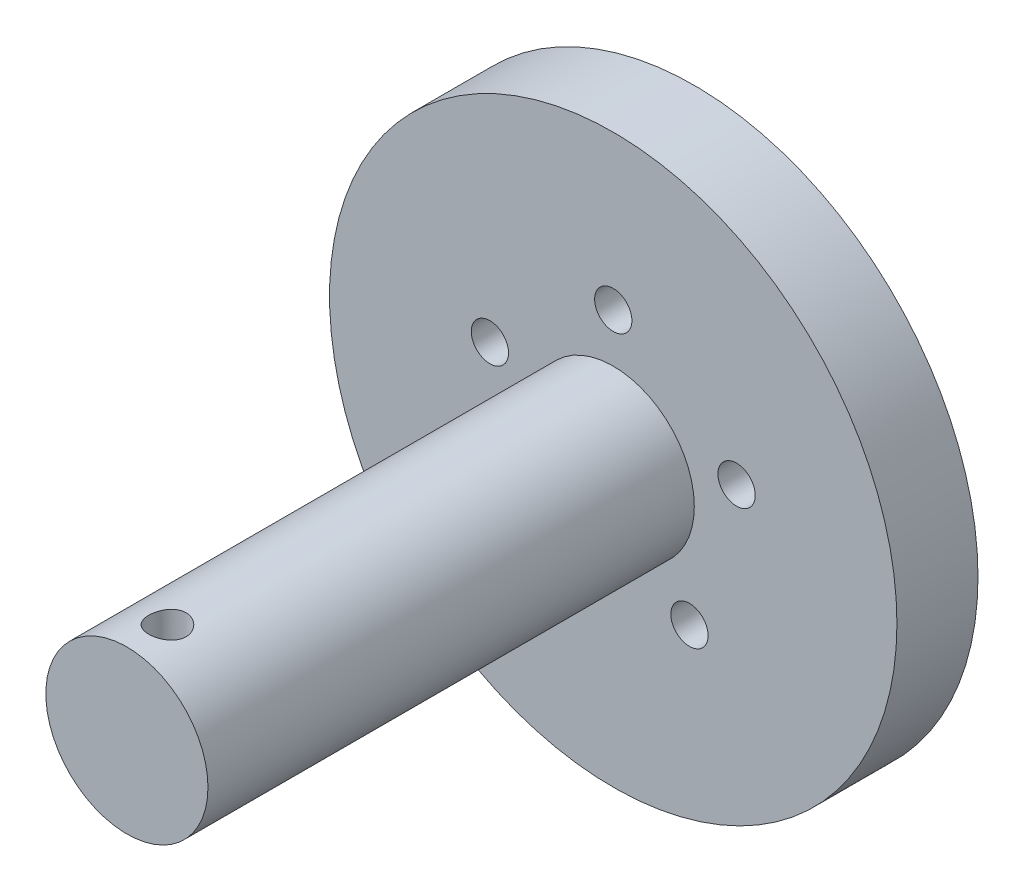
ISO-10303-21;
HEADER;
FILE_DESCRIPTION(('STEP AP214'),'2;1');
FILE_NAME('part.step','',(''),(''),'','','');
FILE_SCHEMA(('AUTOMOTIVE_DESIGN { 1 0 10303 214 1 1 1 1 }'));
ENDSEC;
DATA;
#1=APPLICATION_CONTEXT('core data for automotive mechanical design processes');
#2=APPLICATION_PROTOCOL_DEFINITION('international standard','automotive_design',2000,#1);
#3=PRODUCT_CONTEXT('',#1,'mechanical');
#4=PRODUCT('Part','Part','',(#3));
#5=PRODUCT_RELATED_PRODUCT_CATEGORY('part','',(#4));
#6=PRODUCT_DEFINITION_FORMATION('','',#4);
#7=PRODUCT_DEFINITION_CONTEXT('part definition',#1,'design');
#8=PRODUCT_DEFINITION('design','',#6,#7);
#9=PRODUCT_DEFINITION_SHAPE('','',#8);
#10=(LENGTH_UNIT() NAMED_UNIT(*) SI_UNIT(.MILLI.,.METRE.));
#11=(NAMED_UNIT(*) PLANE_ANGLE_UNIT() SI_UNIT($,.RADIAN.));
#12=(NAMED_UNIT(*) SI_UNIT($,.STERADIAN.) SOLID_ANGLE_UNIT());
#13=UNCERTAINTY_MEASURE_WITH_UNIT(LENGTH_MEASURE(1.E-05),#10,'distance_accuracy_value','');
#14=(GEOMETRIC_REPRESENTATION_CONTEXT(3) GLOBAL_UNCERTAINTY_ASSIGNED_CONTEXT((#13)) GLOBAL_UNIT_ASSIGNED_CONTEXT((#10,
#11,#12)) REPRESENTATION_CONTEXT('',''));
#15=CARTESIAN_POINT('',(0.,0.,0.));
#16=DIRECTION('',(0.,0.,1.));
#17=DIRECTION('',(1.,0.,0.));
#18=AXIS2_PLACEMENT_3D('',#15,#16,#17);
#19=CARTESIAN_POINT('',(0.,0.,12.7));
#20=DIRECTION('',(0.,0.,1.));
#21=DIRECTION('',(1.,0.,0.));
#22=AXIS2_PLACEMENT_3D('',#19,#20,#21);
#23=PLANE('',#22);
#24=CARTESIAN_POINT('',(0.,0.,12.7));
#25=DIRECTION('',(0.,0.,1.));
#26=DIRECTION('',(1.,0.,0.));
#27=AXIS2_PLACEMENT_3D('',#24,#25,#26);
#28=CIRCLE('',#27,12.7);
#29=CARTESIAN_POINT('',(12.7,0.,12.7));
#30=VERTEX_POINT('',#29);
#31=EDGE_CURVE('E92',#30,#30,#28,.T.);
#32=ORIENTED_EDGE('',*,*,#31,.F.);
#33=EDGE_LOOP('',(#32));
#34=FACE_BOUND('',#33,.T.);
#35=CARTESIAN_POINT('',(-11.9437963265832,-16.4392253256988,12.7));
#36=DIRECTION('',(0.,0.,1.));
#37=DIRECTION('',(1.,0.,0.));
#38=AXIS2_PLACEMENT_3D('',#35,#36,#37);
#39=CIRCLE('',#38,2.921);
#40=CARTESIAN_POINT('',(-9.02279632658319,-16.4392253256988,12.7));
#41=VERTEX_POINT('',#40);
#42=EDGE_CURVE('E72',#41,#41,#39,.T.);
#43=ORIENTED_EDGE('',*,*,#42,.F.);
#44=EDGE_LOOP('',(#43));
#45=FACE_BOUND('',#44,.T.);
#46=CARTESIAN_POINT('',(19.3254684111175,6.27922532569888,12.7));
#47=DIRECTION('',(0.,0.,1.));
#48=DIRECTION('',(1.,0.,0.));
#49=AXIS2_PLACEMENT_3D('',#46,#47,#48);
#50=CIRCLE('',#49,2.921);
#51=CARTESIAN_POINT('',(22.2464684111175,6.27922532569888,12.7));
#52=VERTEX_POINT('',#51);
#53=EDGE_CURVE('E56',#52,#52,#50,.T.);
#54=ORIENTED_EDGE('',*,*,#53,.F.);
#55=EDGE_LOOP('',(#54));
#56=FACE_BOUND('',#55,.T.);
#57=CARTESIAN_POINT('',(0.,0.,12.7));
#58=DIRECTION('',(0.,0.,1.));
#59=DIRECTION('',(1.,0.,0.));
#60=AXIS2_PLACEMENT_3D('',#57,#58,#59);
#61=CIRCLE('',#60,44.45);
#62=CARTESIAN_POINT('',(44.45,0.,12.7));
#63=VERTEX_POINT('',#62);
#64=EDGE_CURVE('E10',#63,#63,#61,.T.);
#65=ORIENTED_EDGE('',*,*,#64,.T.);
#66=EDGE_LOOP('',(#65));
#67=FACE_BOUND('',#66,.T.);
#68=CARTESIAN_POINT('',(0.,20.32,12.7));
#69=DIRECTION('',(0.,0.,1.));
#70=DIRECTION('',(1.,0.,0.));
#71=AXIS2_PLACEMENT_3D('',#68,#69,#70);
#72=CIRCLE('',#71,2.921);
#73=CARTESIAN_POINT('',(2.921,20.32,12.7));
#74=VERTEX_POINT('',#73);
#75=EDGE_CURVE('E50',#74,#74,#72,.T.);
#76=ORIENTED_EDGE('',*,*,#75,.F.);
#77=EDGE_LOOP('',(#76));
#78=FACE_BOUND('',#77,.T.);
#79=CARTESIAN_POINT('',(11.943796326583,-16.439225325699,12.7));
#80=DIRECTION('',(0.,0.,1.));
#81=DIRECTION('',(1.,0.,0.));
#82=AXIS2_PLACEMENT_3D('',#79,#80,#81);
#83=CIRCLE('',#82,2.921);
#84=CARTESIAN_POINT('',(14.864796326583,-16.439225325699,12.7));
#85=VERTEX_POINT('',#84);
#86=EDGE_CURVE('E64',#85,#85,#83,.T.);
#87=ORIENTED_EDGE('',*,*,#86,.F.);
#88=EDGE_LOOP('',(#87));
#89=FACE_BOUND('',#88,.T.);
#90=CARTESIAN_POINT('',(-19.3254684111175,6.27922532569915,12.7));
#91=DIRECTION('',(0.,0.,1.));
#92=DIRECTION('',(1.,0.,0.));
#93=AXIS2_PLACEMENT_3D('',#90,#91,#92);
#94=CIRCLE('',#93,2.921);
#95=CARTESIAN_POINT('',(-16.4044684111175,6.27922532569915,12.7));
#96=VERTEX_POINT('',#95);
#97=EDGE_CURVE('E80',#96,#96,#94,.T.);
#98=ORIENTED_EDGE('',*,*,#97,.F.);
#99=EDGE_LOOP('',(#98));
#100=FACE_BOUND('',#99,.T.);
#101=ADVANCED_FACE('F37',(#34,#45,#56,#67,#78,#89,#100),#23,.T.);
#102=CARTESIAN_POINT('',(0.,0.,0.));
#103=DIRECTION('',(0.,0.,1.));
#104=DIRECTION('',(1.,0.,0.));
#105=AXIS2_PLACEMENT_3D('',#102,#103,#104);
#106=PLANE('',#105);
#107=CARTESIAN_POINT('',(0.,0.,0.));
#108=DIRECTION('',(0.,0.,1.));
#109=DIRECTION('',(1.,0.,0.));
#110=AXIS2_PLACEMENT_3D('',#107,#108,#109);
#111=CIRCLE('',#110,44.45);
#112=CARTESIAN_POINT('',(44.45,0.,0.));
#113=VERTEX_POINT('',#112);
#114=EDGE_CURVE('E41',#113,#113,#111,.T.);
#115=ORIENTED_EDGE('',*,*,#114,.F.);
#116=EDGE_LOOP('',(#115));
#117=FACE_BOUND('',#116,.T.);
#118=CARTESIAN_POINT('',(0.,20.32,0.));
#119=DIRECTION('',(0.,0.,1.));
#120=DIRECTION('',(1.,0.,0.));
#121=AXIS2_PLACEMENT_3D('',#118,#119,#120);
#122=CIRCLE('',#121,2.921);
#123=CARTESIAN_POINT('',(2.921,20.32,0.));
#124=VERTEX_POINT('',#123);
#125=EDGE_CURVE('E52',#124,#124,#122,.T.);
#126=ORIENTED_EDGE('',*,*,#125,.T.);
#127=EDGE_LOOP('',(#126));
#128=FACE_BOUND('',#127,.T.);
#129=CARTESIAN_POINT('',(19.3254684111175,6.27922532569888,0.));
#130=DIRECTION('',(0.,0.,1.));
#131=DIRECTION('',(1.,0.,0.));
#132=AXIS2_PLACEMENT_3D('',#129,#130,#131);
#133=CIRCLE('',#132,2.921);
#134=CARTESIAN_POINT('',(22.2464684111175,6.27922532569888,0.));
#135=VERTEX_POINT('',#134);
#136=EDGE_CURVE('E60',#135,#135,#133,.T.);
#137=ORIENTED_EDGE('',*,*,#136,.T.);
#138=EDGE_LOOP('',(#137));
#139=FACE_BOUND('',#138,.T.);
#140=CARTESIAN_POINT('',(11.943796326583,-16.439225325699,0.));
#141=DIRECTION('',(0.,0.,1.));
#142=DIRECTION('',(1.,0.,0.));
#143=AXIS2_PLACEMENT_3D('',#140,#141,#142);
#144=CIRCLE('',#143,2.921);
#145=CARTESIAN_POINT('',(14.864796326583,-16.439225325699,0.));
#146=VERTEX_POINT('',#145);
#147=EDGE_CURVE('E68',#146,#146,#144,.T.);
#148=ORIENTED_EDGE('',*,*,#147,.T.);
#149=EDGE_LOOP('',(#148));
#150=FACE_BOUND('',#149,.T.);
#151=CARTESIAN_POINT('',(-11.9437963265832,-16.4392253256988,0.));
#152=DIRECTION('',(0.,0.,1.));
#153=DIRECTION('',(1.,0.,0.));
#154=AXIS2_PLACEMENT_3D('',#151,#152,#153);
#155=CIRCLE('',#154,2.921);
#156=CARTESIAN_POINT('',(-9.02279632658319,-16.4392253256988,0.));
#157=VERTEX_POINT('',#156);
#158=EDGE_CURVE('E76',#157,#157,#155,.T.);
#159=ORIENTED_EDGE('',*,*,#158,.T.);
#160=EDGE_LOOP('',(#159));
#161=FACE_BOUND('',#160,.T.);
#162=CARTESIAN_POINT('',(-19.3254684111175,6.27922532569915,0.));
#163=DIRECTION('',(0.,0.,1.));
#164=DIRECTION('',(1.,0.,0.));
#165=AXIS2_PLACEMENT_3D('',#162,#163,#164);
#166=CIRCLE('',#165,2.921);
#167=CARTESIAN_POINT('',(-16.4044684111175,6.27922532569915,0.));
#168=VERTEX_POINT('',#167);
#169=EDGE_CURVE('E84',#168,#168,#166,.T.);
#170=ORIENTED_EDGE('',*,*,#169,.T.);
#171=EDGE_LOOP('',(#170));
#172=FACE_BOUND('',#171,.T.);
#173=ADVANCED_FACE('F149',(#117,#128,#139,#150,#161,#172),#106,.F.);
#174=CARTESIAN_POINT('',(0.,0.,12.7));
#175=DIRECTION('',(0.,0.,-1.));
#176=DIRECTION('',(-1.,0.,0.));
#177=AXIS2_PLACEMENT_3D('',#174,#175,#176);
#178=CYLINDRICAL_SURFACE('',#177,44.45);
#179=ORIENTED_EDGE('',*,*,#64,.F.);
#180=EDGE_LOOP('',(#179));
#181=FACE_BOUND('',#180,.T.);
#182=ORIENTED_EDGE('',*,*,#114,.T.);
#183=EDGE_LOOP('',(#182));
#184=FACE_BOUND('',#183,.T.);
#185=ADVANCED_FACE('F39',(#181,#184),#178,.T.);
#186=CARTESIAN_POINT('',(0.,20.32,12.7));
#187=DIRECTION('',(0.,0.,-1.));
#188=DIRECTION('',(-1.,0.,0.));
#189=AXIS2_PLACEMENT_3D('',#186,#187,#188);
#190=CYLINDRICAL_SURFACE('',#189,2.921);
#191=ORIENTED_EDGE('',*,*,#75,.T.);
#192=EDGE_LOOP('',(#191));
#193=FACE_BOUND('',#192,.T.);
#194=ORIENTED_EDGE('',*,*,#125,.F.);
#195=EDGE_LOOP('',(#194));
#196=FACE_BOUND('',#195,.T.);
#197=ADVANCED_FACE('F143',(#193,#196),#190,.F.);
#198=CARTESIAN_POINT('',(19.3254684111175,6.27922532569888,12.7));
#199=DIRECTION('',(0.,0.,-1.));
#200=DIRECTION('',(-1.,0.,0.));
#201=AXIS2_PLACEMENT_3D('',#198,#199,#200);
#202=CYLINDRICAL_SURFACE('',#201,2.921);
#203=ORIENTED_EDGE('',*,*,#53,.T.);
#204=EDGE_LOOP('',(#203));
#205=FACE_BOUND('',#204,.T.);
#206=ORIENTED_EDGE('',*,*,#136,.F.);
#207=EDGE_LOOP('',(#206));
#208=FACE_BOUND('',#207,.T.);
#209=ADVANCED_FACE('F139',(#205,#208),#202,.F.);
#210=CARTESIAN_POINT('',(11.943796326583,-16.439225325699,12.7));
#211=DIRECTION('',(0.,0.,-1.));
#212=DIRECTION('',(-1.,0.,0.));
#213=AXIS2_PLACEMENT_3D('',#210,#211,#212);
#214=CYLINDRICAL_SURFACE('',#213,2.921);
#215=ORIENTED_EDGE('',*,*,#86,.T.);
#216=EDGE_LOOP('',(#215));
#217=FACE_BOUND('',#216,.T.);
#218=ORIENTED_EDGE('',*,*,#147,.F.);
#219=EDGE_LOOP('',(#218));
#220=FACE_BOUND('',#219,.T.);
#221=ADVANCED_FACE('F135',(#217,#220),#214,.F.);
#222=CARTESIAN_POINT('',(-11.9437963265832,-16.4392253256988,12.7));
#223=DIRECTION('',(0.,0.,-1.));
#224=DIRECTION('',(-1.,0.,0.));
#225=AXIS2_PLACEMENT_3D('',#222,#223,#224);
#226=CYLINDRICAL_SURFACE('',#225,2.921);
#227=ORIENTED_EDGE('',*,*,#42,.T.);
#228=EDGE_LOOP('',(#227));
#229=FACE_BOUND('',#228,.T.);
#230=ORIENTED_EDGE('',*,*,#158,.F.);
#231=EDGE_LOOP('',(#230));
#232=FACE_BOUND('',#231,.T.);
#233=ADVANCED_FACE('F131',(#229,#232),#226,.F.);
#234=CARTESIAN_POINT('',(-19.3254684111175,6.27922532569915,12.7));
#235=DIRECTION('',(0.,0.,-1.));
#236=DIRECTION('',(-1.,0.,0.));
#237=AXIS2_PLACEMENT_3D('',#234,#235,#236);
#238=CYLINDRICAL_SURFACE('',#237,2.921);
#239=ORIENTED_EDGE('',*,*,#97,.T.);
#240=EDGE_LOOP('',(#239));
#241=FACE_BOUND('',#240,.T.);
#242=ORIENTED_EDGE('',*,*,#169,.F.);
#243=EDGE_LOOP('',(#242));
#244=FACE_BOUND('',#243,.T.);
#245=ADVANCED_FACE('F127',(#241,#244),#238,.F.);
#246=CARTESIAN_POINT('',(0.,0.,88.9));
#247=DIRECTION('',(0.,0.,-1.));
#248=DIRECTION('',(-1.,0.,0.));
#249=AXIS2_PLACEMENT_3D('',#246,#247,#248);
#250=CYLINDRICAL_SURFACE('',#249,12.7);
#251=CARTESIAN_POINT('',(0.,12.7,79.629));
#252=CARTESIAN_POINT('',(-0.161791988365734,12.6999970647349,79.629005213744));
#253=CARTESIAN_POINT('',(-0.323645239309981,12.6968770614982,79.642487643187));
#254=CARTESIAN_POINT('',(-0.642739986536924,12.6847324159928,79.6959966157916));
#255=CARTESIAN_POINT('',(-0.799978351488787,12.6757038571514,79.7360407660188));
#256=CARTESIAN_POINT('',(-1.10518689570165,12.652745471281,79.8413412481755));
#257=CARTESIAN_POINT('',(-1.25316705672758,12.6388210338969,79.9065698634139));
#258=CARTESIAN_POINT('',(-1.5360803658525,12.6075668031072,80.0602963164342));
#259=CARTESIAN_POINT('',(-1.67101357676364,12.5902370260972,80.1487940421835));
#260=CARTESIAN_POINT('',(-1.92638521991923,12.5537230179431,80.3481969083203));
#261=CARTESIAN_POINT('',(-2.0465607059451,12.5345137956361,80.4594342483214));
#262=CARTESIAN_POINT('',(-2.26672366205061,12.4965784293558,80.7004462152338));
#263=CARTESIAN_POINT('',(-2.36670917577203,12.4778523323493,80.8302226364576));
#264=CARTESIAN_POINT('',(-2.5448404614364,12.4427552467236,81.1066067907473));
#265=CARTESIAN_POINT('',(-2.62270139498788,12.4264161844912,81.2534025224385));
#266=CARTESIAN_POINT('',(-2.75254466561769,12.3983039513594,81.5584336306149));
#267=CARTESIAN_POINT('',(-2.8045304514541,12.3865301720245,81.7166674793541));
#268=CARTESIAN_POINT('',(-2.88026898262257,12.3691369635251,82.0372168099403));
#269=CARTESIAN_POINT('',(-2.90448985025934,12.3634156206721,82.1994160334));
#270=CARTESIAN_POINT('',(-2.92546749520377,12.3584693670794,82.5256688400902));
#271=CARTESIAN_POINT('',(-2.92222802034675,12.3592435698163,82.6897221672173));
#272=CARTESIAN_POINT('',(-2.88875253307513,12.3671088866499,83.0115096273394));
#273=CARTESIAN_POINT('',(-2.85906508317055,12.3740716361207,83.1693044451905));
#274=CARTESIAN_POINT('',(-2.77440752094658,12.3933260161791,83.4776119776536));
#275=CARTESIAN_POINT('',(-2.71943585654971,12.4056179738986,83.6281242445975));
#276=CARTESIAN_POINT('',(-2.58527929519974,12.4342692457019,83.919111573749));
#277=CARTESIAN_POINT('',(-2.50588759799799,12.4506630660977,84.0594877534857));
#278=CARTESIAN_POINT('',(-2.32528973017408,12.4856503267689,84.3251263221978));
#279=CARTESIAN_POINT('',(-2.22408029046686,12.5042440964873,84.4503864418501));
#280=CARTESIAN_POINT('',(-1.99983760019352,12.5420834491417,84.6853905915779));
#281=CARTESIAN_POINT('',(-1.87633907073827,12.5613339683604,84.7946903342701));
#282=CARTESIAN_POINT('',(-1.61254226059999,12.5979129810336,84.9911042681265));
#283=CARTESIAN_POINT('',(-1.47224360995676,12.6152414321455,85.0782179705936));
#284=CARTESIAN_POINT('',(-1.17825525523572,12.6460898028565,85.2279149427527));
#285=CARTESIAN_POINT('',(-1.02453236430194,12.6595999127898,85.2904351880296));
#286=CARTESIAN_POINT('',(-0.708381581725839,12.6812171472574,85.388630437952));
#287=CARTESIAN_POINT('',(-0.545955097640889,12.6893251425971,85.424309769396));
#288=CARTESIAN_POINT('',(-0.220814435132288,12.6990989390001,85.4671530414778));
#289=CARTESIAN_POINT('',(-0.0581841440404706,12.7009016765217,85.4749232105475));
#290=CARTESIAN_POINT('',(0.266051162109857,12.6982477443443,85.4633775099845));
#291=CARTESIAN_POINT('',(0.427656253562983,12.693791546678,85.4440636829571));
#292=CARTESIAN_POINT('',(0.74321122484289,12.679207342039,85.3794000527404));
#293=CARTESIAN_POINT('',(0.897230707331535,12.6691496042788,85.3343726426623));
#294=CARTESIAN_POINT('',(1.19552825469156,12.644490195932,85.2199214388899));
#295=CARTESIAN_POINT('',(1.33980543038584,12.6298881112647,85.1504954219211));
#296=CARTESIAN_POINT('',(1.6169970711578,12.5974249490779,84.9879854131137));
#297=CARTESIAN_POINT('',(1.74970046025281,12.5795168136959,84.8945510066393));
#298=CARTESIAN_POINT('',(1.99776154113808,12.5425159177875,84.6871331132213));
#299=CARTESIAN_POINT('',(2.11311672034808,12.5234229862289,84.5731466549246));
#300=CARTESIAN_POINT('',(2.32563938819834,12.4857243417873,84.325065950726));
#301=CARTESIAN_POINT('',(2.42238502798991,12.4671366696917,84.1906070457365));
#302=CARTESIAN_POINT('',(2.59192805334684,12.4329971520183,83.9069967177311));
#303=CARTESIAN_POINT('',(2.66472650260241,12.4174451716131,83.7578459476834));
#304=CARTESIAN_POINT('',(2.78379411562038,12.3912956852758,83.4498988377611));
#305=CARTESIAN_POINT('',(2.83021721439997,12.3806694992805,83.2911645748488));
#306=CARTESIAN_POINT('',(2.89565432154699,12.3655301108863,82.9678691423473));
#307=CARTESIAN_POINT('',(2.91467325391904,12.3610158103073,82.8033090249983));
#308=CARTESIAN_POINT('',(2.92453562219783,12.3586856440773,82.4772993440764));
#309=CARTESIAN_POINT('',(2.91604962163952,12.3607103545853,82.3158708522279));
#310=CARTESIAN_POINT('',(2.87265442488283,12.3708667391052,81.9968112565602));
#311=CARTESIAN_POINT('',(2.83774561091784,12.3789983247748,81.8391800978428));
#312=CARTESIAN_POINT('',(2.7428348616303,12.4003705499824,81.5327903877183));
#313=CARTESIAN_POINT('',(2.6829403091439,12.4135893074383,81.3839969433403));
#314=CARTESIAN_POINT('',(2.53984711468253,12.4436529279168,81.0984745415724));
#315=CARTESIAN_POINT('',(2.45664575526635,12.4604982137189,80.9617469934434));
#316=CARTESIAN_POINT('',(2.26711897554109,12.4963856088391,80.7009541633519));
#317=CARTESIAN_POINT('',(2.16031993796052,12.5154682801239,80.5772385920194));
#318=CARTESIAN_POINT('',(1.92757677814579,12.553418819743,80.3492659377542));
#319=CARTESIAN_POINT('',(1.80162820464565,12.572286637036,80.2450133915425));
#320=CARTESIAN_POINT('',(1.53193099702332,12.6080109458739,80.0574504902426));
#321=CARTESIAN_POINT('',(1.38794819360235,12.624833843891,79.9744700444766));
#322=CARTESIAN_POINT('',(1.08771455659232,12.6542304997702,79.8340218523783));
#323=CARTESIAN_POINT('',(0.931473620756522,12.666807643198,79.7765337669043));
#324=CARTESIAN_POINT('',(0.646013875560826,12.6841827727737,79.6983636988911));
#325=CARTESIAN_POINT('',(0.518280603611842,12.69007614118,79.6724041460518));
#326=CARTESIAN_POINT('',(0.260378026570594,12.6979858316875,79.6377206620409));
#327=CARTESIAN_POINT('',(0.13020885285631,12.700002362277,79.628995804022));
#328=CARTESIAN_POINT('',(0.,12.7,79.629));
#329=B_SPLINE_CURVE_WITH_KNOTS('',3,(#251,#252,#253,#254,#255,#256,#257,#258,#259,#260,#261,
#262,#263,#264,#265,#266,#267,#268,#269,#270,#271,#272,#273,#274,#275,#276,#277,#278,#279,#280,
#281,#282,#283,#284,#285,#286,#287,#288,#289,#290,#291,#292,#293,#294,#295,#296,#297,#298,#299,
#300,#301,#302,#303,#304,#305,#306,#307,#308,#309,#310,#311,#312,#313,#314,#315,#316,#317,#318,
#319,#320,#321,#322,#323,#324,#325,#326,#327,#328),.UNSPECIFIED.,.T.,.F.,(4,2,2,2,2,2,2,2,2,2,2,
2,2,2,2,2,2,2,2,2,2,2,2,2,2,2,2,2,2,2,2,2,2,2,2,2,2,2,4),(0.,0.484899162894526,
0.970120074326081,1.45480849247283,1.93949457705972,2.43184500537262,2.92424311835149,
3.42271966492525,3.92112975446096,4.41100688626889,4.90081715987015,5.38069876831247,
5.86060983833309,6.34470244785138,6.82886764238891,7.32464721045125,7.82043769822319,
8.31749057284787,8.81446330456851,9.3005734716013,9.78664697942677,10.2667559265233,
10.7469086339406,11.2345125418666,11.7221870026933,12.2198699218079,12.7175307317752,
13.2122563831141,13.706893130625,14.1895623045773,14.6722244963531,15.1528333486866,
15.6334982606208,16.1248653125685,16.6163467567817,17.1150433796172,17.6133413970774,
18.0036052173584,18.3938480494617),.UNSPECIFIED.);
#330=CARTESIAN_POINT('',(0.,12.7,79.629));
#331=VERTEX_POINT('',#330);
#332=EDGE_CURVE('E96',#331,#331,#329,.T.);
#333=ORIENTED_EDGE('',*,*,#332,.F.);
#334=EDGE_LOOP('',(#333));
#335=FACE_BOUND('',#334,.T.);
#336=CARTESIAN_POINT('',(0.,-12.7,79.629));
#337=CARTESIAN_POINT('',(0.161791988365734,-12.6999970647349,79.629005213744));
#338=CARTESIAN_POINT('',(0.323645239309981,-12.6968770614982,79.642487643187));
#339=CARTESIAN_POINT('',(0.642739986536924,-12.6847324159928,79.6959966157916));
#340=CARTESIAN_POINT('',(0.799978351488787,-12.6757038571514,79.7360407660188));
#341=CARTESIAN_POINT('',(1.10518689570165,-12.652745471281,79.8413412481755));
#342=CARTESIAN_POINT('',(1.25316705672758,-12.6388210338969,79.9065698634139));
#343=CARTESIAN_POINT('',(1.5360803658525,-12.6075668031072,80.0602963164342));
#344=CARTESIAN_POINT('',(1.67101357676364,-12.5902370260972,80.1487940421835));
#345=CARTESIAN_POINT('',(1.92638521991923,-12.5537230179431,80.3481969083203));
#346=CARTESIAN_POINT('',(2.0465607059451,-12.5345137956361,80.4594342483214));
#347=CARTESIAN_POINT('',(2.26672366205061,-12.4965784293558,80.7004462152338));
#348=CARTESIAN_POINT('',(2.36670917577203,-12.4778523323493,80.8302226364576));
#349=CARTESIAN_POINT('',(2.5448404614364,-12.4427552467236,81.1066067907473));
#350=CARTESIAN_POINT('',(2.62270139498788,-12.4264161844912,81.2534025224385));
#351=CARTESIAN_POINT('',(2.75254466561769,-12.3983039513594,81.5584336306149));
#352=CARTESIAN_POINT('',(2.8045304514541,-12.3865301720245,81.7166674793541));
#353=CARTESIAN_POINT('',(2.88026898262257,-12.3691369635251,82.0372168099403));
#354=CARTESIAN_POINT('',(2.90448985025934,-12.3634156206721,82.1994160334));
#355=CARTESIAN_POINT('',(2.92546749520377,-12.3584693670794,82.5256688400902));
#356=CARTESIAN_POINT('',(2.92222802034675,-12.3592435698163,82.6897221672173));
#357=CARTESIAN_POINT('',(2.88875253307513,-12.3671088866499,83.0115096273394));
#358=CARTESIAN_POINT('',(2.85906508317055,-12.3740716361207,83.1693044451905));
#359=CARTESIAN_POINT('',(2.77440752094658,-12.3933260161791,83.4776119776536));
#360=CARTESIAN_POINT('',(2.71943585654971,-12.4056179738986,83.6281242445975));
#361=CARTESIAN_POINT('',(2.58527929519974,-12.4342692457019,83.919111573749));
#362=CARTESIAN_POINT('',(2.50588759799799,-12.4506630660977,84.0594877534857));
#363=CARTESIAN_POINT('',(2.32528973017408,-12.4856503267689,84.3251263221978));
#364=CARTESIAN_POINT('',(2.22408029046686,-12.5042440964873,84.4503864418501));
#365=CARTESIAN_POINT('',(1.99983760019352,-12.5420834491417,84.6853905915779));
#366=CARTESIAN_POINT('',(1.87633907073827,-12.5613339683604,84.7946903342701));
#367=CARTESIAN_POINT('',(1.61254226059999,-12.5979129810336,84.9911042681265));
#368=CARTESIAN_POINT('',(1.47224360995676,-12.6152414321455,85.0782179705936));
#369=CARTESIAN_POINT('',(1.17825525523572,-12.6460898028565,85.2279149427527));
#370=CARTESIAN_POINT('',(1.02453236430194,-12.6595999127898,85.2904351880296));
#371=CARTESIAN_POINT('',(0.708381581725839,-12.6812171472574,85.388630437952));
#372=CARTESIAN_POINT('',(0.545955097640889,-12.6893251425971,85.424309769396));
#373=CARTESIAN_POINT('',(0.220814435132289,-12.6990989390001,85.4671530414778));
#374=CARTESIAN_POINT('',(0.0581841440404714,-12.7009016765217,85.4749232105475));
#375=CARTESIAN_POINT('',(-0.266051162109856,-12.6982477443443,85.4633775099845));
#376=CARTESIAN_POINT('',(-0.427656253562983,-12.693791546678,85.4440636829571));
#377=CARTESIAN_POINT('',(-0.743211224842889,-12.679207342039,85.3794000527404));
#378=CARTESIAN_POINT('',(-0.897230707331533,-12.6691496042788,85.3343726426623));
#379=CARTESIAN_POINT('',(-1.19552825469156,-12.644490195932,85.2199214388899));
#380=CARTESIAN_POINT('',(-1.33980543038585,-12.6298881112647,85.1504954219211));
#381=CARTESIAN_POINT('',(-1.6169970711578,-12.5974249490779,84.9879854131137));
#382=CARTESIAN_POINT('',(-1.74970046025281,-12.5795168136959,84.8945510066393));
#383=CARTESIAN_POINT('',(-1.99776154113808,-12.5425159177875,84.6871331132213));
#384=CARTESIAN_POINT('',(-2.11311672034808,-12.5234229862289,84.5731466549246));
#385=CARTESIAN_POINT('',(-2.32563938819834,-12.4857243417873,84.325065950726));
#386=CARTESIAN_POINT('',(-2.42238502798991,-12.4671366696917,84.1906070457365));
#387=CARTESIAN_POINT('',(-2.59192805334684,-12.4329971520183,83.9069967177311));
#388=CARTESIAN_POINT('',(-2.66472650260241,-12.4174451716131,83.7578459476834));
#389=CARTESIAN_POINT('',(-2.78379411562038,-12.3912956852758,83.4498988377611));
#390=CARTESIAN_POINT('',(-2.83021721439997,-12.3806694992805,83.2911645748488));
#391=CARTESIAN_POINT('',(-2.89565432154699,-12.3655301108863,82.9678691423473));
#392=CARTESIAN_POINT('',(-2.91467325391904,-12.3610158103073,82.8033090249983));
#393=CARTESIAN_POINT('',(-2.92453562219783,-12.3586856440773,82.4772993440764));
#394=CARTESIAN_POINT('',(-2.91604962163952,-12.3607103545853,82.3158708522279));
#395=CARTESIAN_POINT('',(-2.87265442488283,-12.3708667391052,81.9968112565602));
#396=CARTESIAN_POINT('',(-2.83774561091784,-12.3789983247748,81.8391800978428));
#397=CARTESIAN_POINT('',(-2.7428348616303,-12.4003705499824,81.5327903877183));
#398=CARTESIAN_POINT('',(-2.6829403091439,-12.4135893074383,81.3839969433403));
#399=CARTESIAN_POINT('',(-2.53984711468253,-12.4436529279168,81.0984745415724));
#400=CARTESIAN_POINT('',(-2.45664575526635,-12.4604982137189,80.9617469934434));
#401=CARTESIAN_POINT('',(-2.26711897554109,-12.4963856088391,80.7009541633519));
#402=CARTESIAN_POINT('',(-2.16031993796052,-12.5154682801239,80.5772385920194));
#403=CARTESIAN_POINT('',(-1.92757677814579,-12.553418819743,80.3492659377542));
#404=CARTESIAN_POINT('',(-1.80162820464565,-12.572286637036,80.2450133915425));
#405=CARTESIAN_POINT('',(-1.53193099702332,-12.6080109458739,80.0574504902425));
#406=CARTESIAN_POINT('',(-1.38794819360234,-12.624833843891,79.9744700444766));
#407=CARTESIAN_POINT('',(-1.08771455659231,-12.6542304997702,79.8340218523783));
#408=CARTESIAN_POINT('',(-0.931473620756521,-12.666807643198,79.7765337669043));
#409=CARTESIAN_POINT('',(-0.646013875560826,-12.6841827727737,79.6983636988911));
#410=CARTESIAN_POINT('',(-0.518280603611843,-12.69007614118,79.6724041460518));
#411=CARTESIAN_POINT('',(-0.260378026570594,-12.6979858316875,79.6377206620409));
#412=CARTESIAN_POINT('',(-0.13020885285631,-12.700002362277,79.628995804022));
#413=CARTESIAN_POINT('',(0.,-12.7,79.629));
#414=B_SPLINE_CURVE_WITH_KNOTS('',3,(#336,#337,#338,#339,#340,#341,#342,#343,#344,#345,#346,
#347,#348,#349,#350,#351,#352,#353,#354,#355,#356,#357,#358,#359,#360,#361,#362,#363,#364,#365,
#366,#367,#368,#369,#370,#371,#372,#373,#374,#375,#376,#377,#378,#379,#380,#381,#382,#383,#384,
#385,#386,#387,#388,#389,#390,#391,#392,#393,#394,#395,#396,#397,#398,#399,#400,#401,#402,#403,
#404,#405,#406,#407,#408,#409,#410,#411,#412,#413),.UNSPECIFIED.,.T.,.F.,(4,2,2,2,2,2,2,2,2,2,2,
2,2,2,2,2,2,2,2,2,2,2,2,2,2,2,2,2,2,2,2,2,2,2,2,2,2,2,4),(0.,0.484899162894526,
0.970120074326081,1.45480849247283,1.93949457705972,2.4318450053726,2.92424311835149,
3.42271966492525,3.92112975446096,4.41100688626889,4.90081715987015,5.38069876831247,
5.86060983833309,6.34470244785139,6.82886764238891,7.32464721045126,7.82043769822319,
8.31749057284787,8.81446330456852,9.3005734716013,9.78664697942678,10.2667559265233,
10.7469086339406,11.2345125418666,11.7221870026933,12.2198699218079,12.7175307317752,
13.2122563831141,13.706893130625,14.1895623045773,14.6722244963531,15.1528333486866,
15.6334982606208,16.1248653125685,16.6163467567817,17.1150433796172,17.6133413970774,
18.0036052173584,18.3938480494617),.UNSPECIFIED.);
#415=CARTESIAN_POINT('',(0.,-12.7,79.629));
#416=VERTEX_POINT('',#415);
#417=EDGE_CURVE('E108',#416,#416,#414,.T.);
#418=ORIENTED_EDGE('',*,*,#417,.F.);
#419=EDGE_LOOP('',(#418));
#420=FACE_BOUND('',#419,.T.);
#421=CARTESIAN_POINT('',(0.,0.,88.9));
#422=DIRECTION('',(0.,0.,1.));
#423=DIRECTION('',(1.,0.,0.));
#424=AXIS2_PLACEMENT_3D('',#421,#422,#423);
#425=CIRCLE('',#424,12.7);
#426=CARTESIAN_POINT('',(12.7,0.,88.9));
#427=VERTEX_POINT('',#426);
#428=EDGE_CURVE('E88',#427,#427,#425,.T.);
#429=ORIENTED_EDGE('',*,*,#428,.F.);
#430=EDGE_LOOP('',(#429));
#431=FACE_BOUND('',#430,.T.);
#432=ORIENTED_EDGE('',*,*,#31,.T.);
#433=EDGE_LOOP('',(#432));
#434=FACE_BOUND('',#433,.T.);
#435=ADVANCED_FACE('F123',(#335,#420,#431,#434),#250,.T.);
#436=CARTESIAN_POINT('',(0.,0.,88.9));
#437=DIRECTION('',(0.,0.,1.));
#438=DIRECTION('',(1.,0.,0.));
#439=AXIS2_PLACEMENT_3D('',#436,#437,#438);
#440=PLANE('',#439);
#441=ORIENTED_EDGE('',*,*,#428,.T.);
#442=EDGE_LOOP('',(#441));
#443=FACE_BOUND('',#442,.T.);
#444=ADVANCED_FACE('F118',(#443),#440,.T.);
#445=CARTESIAN_POINT('',(0.,44.451,82.55));
#446=DIRECTION('',(0.,-1.,0.));
#447=DIRECTION('',(0.,0.,-1.));
#448=AXIS2_PLACEMENT_3D('',#445,#446,#447);
#449=CYLINDRICAL_SURFACE('',#448,2.921);
#450=ORIENTED_EDGE('',*,*,#332,.T.);
#451=EDGE_LOOP('',(#450));
#452=FACE_BOUND('',#451,.T.);
#453=ORIENTED_EDGE('',*,*,#417,.T.);
#454=EDGE_LOOP('',(#453));
#455=FACE_BOUND('',#454,.T.);
#456=ADVANCED_FACE('F112',(#452,#455),#449,.F.);
#457=CLOSED_SHELL('',(#101,#173,#185,#197,#209,#221,#233,#245,#435,#444,#456));
#458=MANIFOLD_SOLID_BREP('B2',#457);
#459=ADVANCED_BREP_SHAPE_REPRESENTATION('',(#18,#458),#14);
#460=SHAPE_DEFINITION_REPRESENTATION(#9,#459);
ENDSEC;
END-ISO-10303-21;
